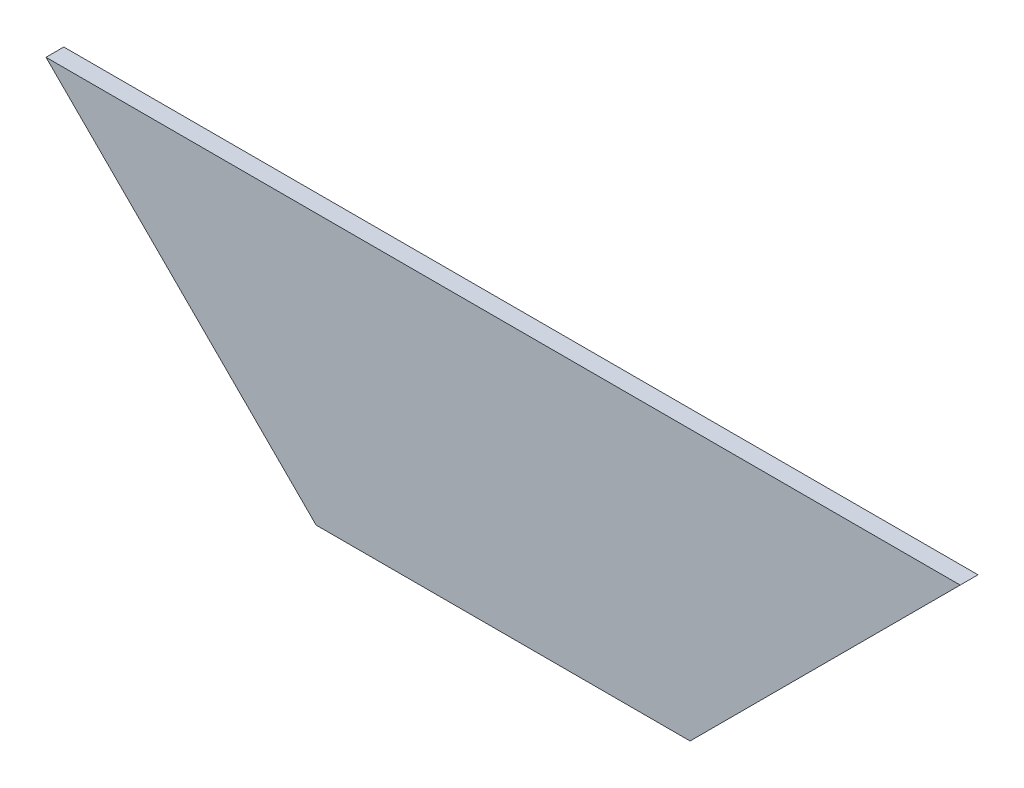
ISO-10303-21;
HEADER;
FILE_DESCRIPTION(('STEP AP214'),'2;1');
FILE_NAME('part.step','',(''),(''),'','','');
FILE_SCHEMA(('AUTOMOTIVE_DESIGN { 1 0 10303 214 1 1 1 1 }'));
ENDSEC;
DATA;
#1=APPLICATION_CONTEXT('core data for automotive mechanical design processes');
#2=APPLICATION_PROTOCOL_DEFINITION('international standard','automotive_design',2000,#1);
#3=PRODUCT_CONTEXT('',#1,'mechanical');
#4=PRODUCT('Part','Part','',(#3));
#5=PRODUCT_RELATED_PRODUCT_CATEGORY('part','',(#4));
#6=PRODUCT_DEFINITION_FORMATION('','',#4);
#7=PRODUCT_DEFINITION_CONTEXT('part definition',#1,'design');
#8=PRODUCT_DEFINITION('design','',#6,#7);
#9=PRODUCT_DEFINITION_SHAPE('','',#8);
#10=(LENGTH_UNIT() NAMED_UNIT(*) SI_UNIT(.MILLI.,.METRE.));
#11=(NAMED_UNIT(*) PLANE_ANGLE_UNIT() SI_UNIT($,.RADIAN.));
#12=(NAMED_UNIT(*) SI_UNIT($,.STERADIAN.) SOLID_ANGLE_UNIT());
#13=UNCERTAINTY_MEASURE_WITH_UNIT(LENGTH_MEASURE(1.E-05),#10,'distance_accuracy_value','');
#14=(GEOMETRIC_REPRESENTATION_CONTEXT(3) GLOBAL_UNCERTAINTY_ASSIGNED_CONTEXT((#13)) GLOBAL_UNIT_ASSIGNED_CONTEXT((#10,
#11,#12)) REPRESENTATION_CONTEXT('',''));
#15=CARTESIAN_POINT('',(0.,0.,0.));
#16=DIRECTION('',(0.,0.,1.));
#17=DIRECTION('',(1.,0.,0.));
#18=AXIS2_PLACEMENT_3D('',#15,#16,#17);
#19=CARTESIAN_POINT('',(-154.,91.0000000000003,6.));
#20=DIRECTION('',(0.707106781186548,0.707106781186547,0.));
#21=DIRECTION('',(-0.707106781186547,0.707106781186548,0.));
#22=AXIS2_PLACEMENT_3D('',#19,#20,#21);
#23=PLANE('',#22);
#24=DIRECTION('',(0.707106781186547,-0.707106781186548,0.));
#25=VECTOR('',#24,1.);
#26=CARTESIAN_POINT('',(-154.,91.0000000000003,0.));
#27=LINE('',#26,#25);
#28=CARTESIAN_POINT('',(-154.,91.0000000000003,0.));
#29=VERTEX_POINT('',#28);
#30=CARTESIAN_POINT('',(-63.,0.,0.));
#31=VERTEX_POINT('',#30);
#32=EDGE_CURVE('E96',#29,#31,#27,.T.);
#33=ORIENTED_EDGE('',*,*,#32,.T.);
#34=DIRECTION('',(0.,0.,-1.));
#35=VECTOR('',#34,1.);
#36=CARTESIAN_POINT('',(-63.,0.,6.));
#37=LINE('',#36,#35);
#38=CARTESIAN_POINT('',(-63.,0.,6.));
#39=VERTEX_POINT('',#38);
#40=EDGE_CURVE('E11',#39,#31,#37,.T.);
#41=ORIENTED_EDGE('',*,*,#40,.F.);
#42=DIRECTION('',(0.707106781186547,-0.707106781186548,0.));
#43=VECTOR('',#42,1.);
#44=CARTESIAN_POINT('',(-154.,91.0000000000003,6.));
#45=LINE('',#44,#43);
#46=CARTESIAN_POINT('',(-154.,91.0000000000003,6.));
#47=VERTEX_POINT('',#46);
#48=EDGE_CURVE('E84',#47,#39,#45,.T.);
#49=ORIENTED_EDGE('',*,*,#48,.F.);
#50=DIRECTION('',(0.,0.,-1.));
#51=VECTOR('',#50,1.);
#52=CARTESIAN_POINT('',(-154.,91.0000000000003,6.));
#53=LINE('',#52,#51);
#54=EDGE_CURVE('E92',#47,#29,#53,.T.);
#55=ORIENTED_EDGE('',*,*,#54,.T.);
#56=EDGE_LOOP('',(#33,#41,#49,#55));
#57=FACE_BOUND('',#56,.T.);
#58=ADVANCED_FACE('F33',(#57),#23,.F.);
#59=CARTESIAN_POINT('',(-63.,0.,6.));
#60=DIRECTION('',(0.,1.,0.));
#61=DIRECTION('',(-1.,0.,0.));
#62=AXIS2_PLACEMENT_3D('',#59,#60,#61);
#63=PLANE('',#62);
#64=DIRECTION('',(1.,0.,0.));
#65=VECTOR('',#64,1.);
#66=CARTESIAN_POINT('',(-63.,0.,0.));
#67=LINE('',#66,#65);
#68=CARTESIAN_POINT('',(63.,0.,0.));
#69=VERTEX_POINT('',#68);
#70=EDGE_CURVE('E88',#31,#69,#67,.T.);
#71=ORIENTED_EDGE('',*,*,#70,.T.);
#72=DIRECTION('',(0.,0.,-1.));
#73=VECTOR('',#72,1.);
#74=CARTESIAN_POINT('',(63.,0.,6.));
#75=LINE('',#74,#73);
#76=CARTESIAN_POINT('',(63.,0.,6.));
#77=VERTEX_POINT('',#76);
#78=EDGE_CURVE('E41',#77,#69,#75,.T.);
#79=ORIENTED_EDGE('',*,*,#78,.F.);
#80=DIRECTION('',(1.,0.,0.));
#81=VECTOR('',#80,1.);
#82=CARTESIAN_POINT('',(-63.,0.,6.));
#83=LINE('',#82,#81);
#84=EDGE_CURVE('E79',#39,#77,#83,.T.);
#85=ORIENTED_EDGE('',*,*,#84,.F.);
#86=ORIENTED_EDGE('',*,*,#40,.T.);
#87=EDGE_LOOP('',(#71,#79,#85,#86));
#88=FACE_BOUND('',#87,.T.);
#89=ADVANCED_FACE('F87',(#88),#63,.F.);
#90=CARTESIAN_POINT('',(63.,0.,6.));
#91=DIRECTION('',(-0.707106781186549,0.707106781186546,0.));
#92=DIRECTION('',(-0.707106781186546,-0.707106781186549,0.));
#93=AXIS2_PLACEMENT_3D('',#90,#91,#92);
#94=PLANE('',#93);
#95=DIRECTION('',(0.707106781186546,0.707106781186549,0.));
#96=VECTOR('',#95,1.);
#97=CARTESIAN_POINT('',(63.,0.,0.));
#98=LINE('',#97,#96);
#99=CARTESIAN_POINT('',(154.,91.0000000000003,0.));
#100=VERTEX_POINT('',#99);
#101=EDGE_CURVE('E66',#69,#100,#98,.T.);
#102=ORIENTED_EDGE('',*,*,#101,.T.);
#103=DIRECTION('',(0.,0.,-1.));
#104=VECTOR('',#103,1.);
#105=CARTESIAN_POINT('',(154.,91.0000000000003,6.));
#106=LINE('',#105,#104);
#107=CARTESIAN_POINT('',(154.,91.0000000000003,6.));
#108=VERTEX_POINT('',#107);
#109=EDGE_CURVE('E89',#108,#100,#106,.T.);
#110=ORIENTED_EDGE('',*,*,#109,.F.);
#111=DIRECTION('',(0.707106781186546,0.707106781186549,0.));
#112=VECTOR('',#111,1.);
#113=CARTESIAN_POINT('',(63.,0.,6.));
#114=LINE('',#113,#112);
#115=EDGE_CURVE('E82',#77,#108,#114,.T.);
#116=ORIENTED_EDGE('',*,*,#115,.F.);
#117=ORIENTED_EDGE('',*,*,#78,.T.);
#118=EDGE_LOOP('',(#102,#110,#116,#117));
#119=FACE_BOUND('',#118,.T.);
#120=ADVANCED_FACE('F90',(#119),#94,.F.);
#121=CARTESIAN_POINT('',(154.,91.0000000000003,6.));
#122=DIRECTION('',(0.,-1.,0.));
#123=DIRECTION('',(1.,0.,0.));
#124=AXIS2_PLACEMENT_3D('',#121,#122,#123);
#125=PLANE('',#124);
#126=DIRECTION('',(-1.,0.,0.));
#127=VECTOR('',#126,1.);
#128=CARTESIAN_POINT('',(154.,91.0000000000003,0.));
#129=LINE('',#128,#127);
#130=EDGE_CURVE('E72',#100,#29,#129,.T.);
#131=ORIENTED_EDGE('',*,*,#130,.T.);
#132=ORIENTED_EDGE('',*,*,#54,.F.);
#133=DIRECTION('',(-1.,0.,0.));
#134=VECTOR('',#133,1.);
#135=CARTESIAN_POINT('',(154.,91.0000000000003,6.));
#136=LINE('',#135,#134);
#137=EDGE_CURVE('E49',#108,#47,#136,.T.);
#138=ORIENTED_EDGE('',*,*,#137,.F.);
#139=ORIENTED_EDGE('',*,*,#109,.T.);
#140=EDGE_LOOP('',(#131,#132,#138,#139));
#141=FACE_BOUND('',#140,.T.);
#142=ADVANCED_FACE('F103',(#141),#125,.F.);
#143=CARTESIAN_POINT('',(0.,0.,6.));
#144=DIRECTION('',(0.,0.,1.));
#145=DIRECTION('',(1.,0.,0.));
#146=AXIS2_PLACEMENT_3D('',#143,#144,#145);
#147=PLANE('',#146);
#148=ORIENTED_EDGE('',*,*,#48,.T.);
#149=ORIENTED_EDGE('',*,*,#84,.T.);
#150=ORIENTED_EDGE('',*,*,#115,.T.);
#151=ORIENTED_EDGE('',*,*,#137,.T.);
#152=EDGE_LOOP('',(#148,#149,#150,#151));
#153=FACE_BOUND('',#152,.T.);
#154=ADVANCED_FACE('F80',(#153),#147,.T.);
#155=CARTESIAN_POINT('',(0.,0.,0.));
#156=DIRECTION('',(0.,0.,1.));
#157=DIRECTION('',(1.,0.,0.));
#158=AXIS2_PLACEMENT_3D('',#155,#156,#157);
#159=PLANE('',#158);
#160=ORIENTED_EDGE('',*,*,#32,.F.);
#161=ORIENTED_EDGE('',*,*,#130,.F.);
#162=ORIENTED_EDGE('',*,*,#101,.F.);
#163=ORIENTED_EDGE('',*,*,#70,.F.);
#164=EDGE_LOOP('',(#160,#161,#162,#163));
#165=FACE_BOUND('',#164,.T.);
#166=ADVANCED_FACE('F106',(#165),#159,.F.);
#167=CLOSED_SHELL('',(#58,#89,#120,#142,#154,#166));
#168=MANIFOLD_SOLID_BREP('B2',#167);
#169=ADVANCED_BREP_SHAPE_REPRESENTATION('',(#18,#168),#14);
#170=SHAPE_DEFINITION_REPRESENTATION(#9,#169);
ENDSEC;
END-ISO-10303-21;
